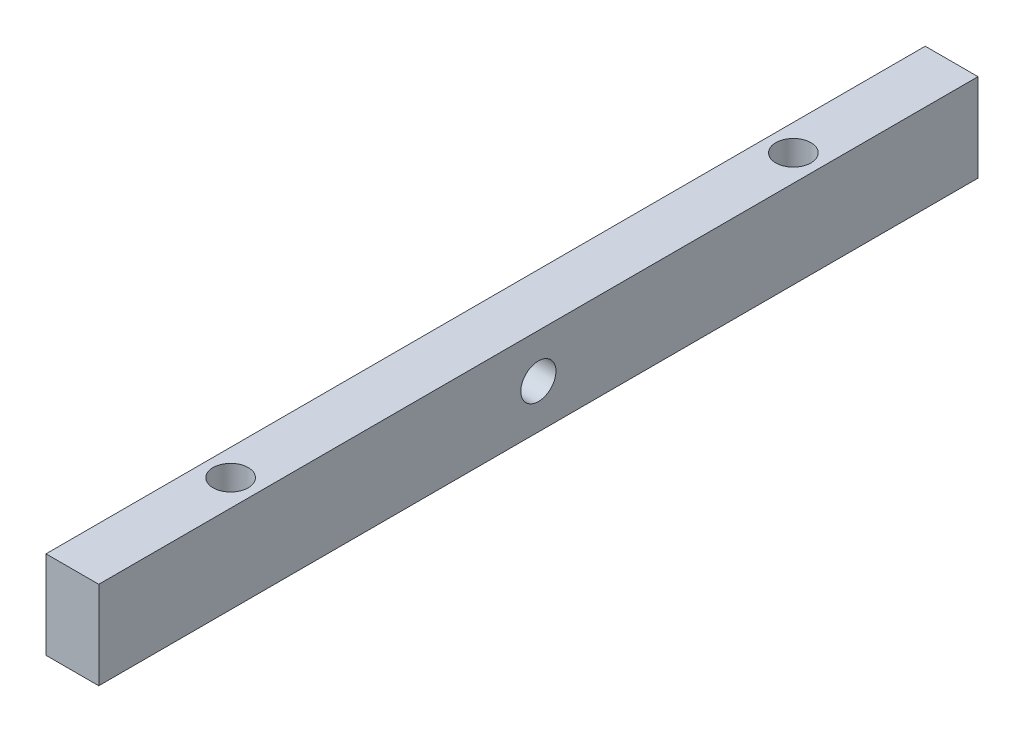
ISO-10303-21;
HEADER;
FILE_DESCRIPTION(('STEP AP214'),'2;1');
FILE_NAME('part.step','',(''),(''),'','','');
FILE_SCHEMA(('AUTOMOTIVE_DESIGN { 1 0 10303 214 1 1 1 1 }'));
ENDSEC;
DATA;
#1=APPLICATION_CONTEXT('core data for automotive mechanical design processes');
#2=APPLICATION_PROTOCOL_DEFINITION('international standard','automotive_design',2000,#1);
#3=PRODUCT_CONTEXT('',#1,'mechanical');
#4=PRODUCT('Part','Part','',(#3));
#5=PRODUCT_RELATED_PRODUCT_CATEGORY('part','',(#4));
#6=PRODUCT_DEFINITION_FORMATION('','',#4);
#7=PRODUCT_DEFINITION_CONTEXT('part definition',#1,'design');
#8=PRODUCT_DEFINITION('design','',#6,#7);
#9=PRODUCT_DEFINITION_SHAPE('','',#8);
#10=(LENGTH_UNIT() NAMED_UNIT(*) SI_UNIT(.MILLI.,.METRE.));
#11=(NAMED_UNIT(*) PLANE_ANGLE_UNIT() SI_UNIT($,.RADIAN.));
#12=(NAMED_UNIT(*) SI_UNIT($,.STERADIAN.) SOLID_ANGLE_UNIT());
#13=UNCERTAINTY_MEASURE_WITH_UNIT(LENGTH_MEASURE(1.E-05),#10,'distance_accuracy_value','');
#14=(GEOMETRIC_REPRESENTATION_CONTEXT(3) GLOBAL_UNCERTAINTY_ASSIGNED_CONTEXT((#13)) GLOBAL_UNIT_ASSIGNED_CONTEXT((#10,
#11,#12)) REPRESENTATION_CONTEXT('',''));
#15=CARTESIAN_POINT('',(0.,0.,0.));
#16=DIRECTION('',(0.,0.,1.));
#17=DIRECTION('',(1.,0.,0.));
#18=AXIS2_PLACEMENT_3D('',#15,#16,#17);
#19=CARTESIAN_POINT('',(15.,25.,500.));
#20=DIRECTION('',(-1.,0.,0.));
#21=DIRECTION('',(0.,-1.,0.));
#22=AXIS2_PLACEMENT_3D('',#19,#20,#21);
#23=PLANE('',#22);
#24=CARTESIAN_POINT('',(15.,0.,250.));
#25=DIRECTION('',(-1.,0.,0.));
#26=DIRECTION('',(0.,-1.,0.));
#27=AXIS2_PLACEMENT_3D('',#24,#25,#26);
#28=CIRCLE('',#27,9.99999999999998);
#29=CARTESIAN_POINT('',(15.,-9.99999999999997,250.));
#30=VERTEX_POINT('',#29);
#31=EDGE_CURVE('E117',#30,#30,#28,.T.);
#32=ORIENTED_EDGE('',*,*,#31,.T.);
#33=EDGE_LOOP('',(#32));
#34=FACE_BOUND('',#33,.T.);
#35=DIRECTION('',(0.,1.,0.));
#36=VECTOR('',#35,1.);
#37=CARTESIAN_POINT('',(15.,25.,0.));
#38=LINE('',#37,#36);
#39=CARTESIAN_POINT('',(15.,-25.,0.));
#40=VERTEX_POINT('',#39);
#41=CARTESIAN_POINT('',(15.,25.,0.));
#42=VERTEX_POINT('',#41);
#43=EDGE_CURVE('E99',#40,#42,#38,.T.);
#44=ORIENTED_EDGE('',*,*,#43,.T.);
#45=DIRECTION('',(0.,0.,-1.));
#46=VECTOR('',#45,1.);
#47=CARTESIAN_POINT('',(15.,25.,500.));
#48=LINE('',#47,#46);
#49=CARTESIAN_POINT('',(15.,25.,500.));
#50=VERTEX_POINT('',#49);
#51=EDGE_CURVE('E11',#50,#42,#48,.T.);
#52=ORIENTED_EDGE('',*,*,#51,.F.);
#53=DIRECTION('',(0.,1.,0.));
#54=VECTOR('',#53,1.);
#55=CARTESIAN_POINT('',(15.,25.,500.));
#56=LINE('',#55,#54);
#57=CARTESIAN_POINT('',(15.,-25.,500.));
#58=VERTEX_POINT('',#57);
#59=EDGE_CURVE('E87',#58,#50,#56,.T.);
#60=ORIENTED_EDGE('',*,*,#59,.F.);
#61=DIRECTION('',(0.,0.,-1.));
#62=VECTOR('',#61,1.);
#63=CARTESIAN_POINT('',(15.,-25.,500.));
#64=LINE('',#63,#62);
#65=EDGE_CURVE('E95',#58,#40,#64,.T.);
#66=ORIENTED_EDGE('',*,*,#65,.T.);
#67=EDGE_LOOP('',(#44,#52,#60,#66));
#68=FACE_BOUND('',#67,.T.);
#69=ADVANCED_FACE('F36',(#34,#68),#23,.F.);
#70=CARTESIAN_POINT('',(-15.,25.,500.));
#71=DIRECTION('',(0.,-1.,0.));
#72=DIRECTION('',(0.,0.,-1.));
#73=AXIS2_PLACEMENT_3D('',#70,#71,#72);
#74=PLANE('',#73);
#75=CARTESIAN_POINT('',(0.,25.,90.));
#76=DIRECTION('',(0.,1.,0.));
#77=DIRECTION('',(0.,0.,1.));
#78=AXIS2_PLACEMENT_3D('',#75,#76,#77);
#79=CIRCLE('',#78,10.);
#80=CARTESIAN_POINT('',(0.,25.,100.));
#81=VERTEX_POINT('',#80);
#82=EDGE_CURVE('E120',#81,#81,#79,.T.);
#83=ORIENTED_EDGE('',*,*,#82,.F.);
#84=EDGE_LOOP('',(#83));
#85=FACE_BOUND('',#84,.T.);
#86=CARTESIAN_POINT('',(0.,25.,410.));
#87=DIRECTION('',(0.,1.,0.));
#88=DIRECTION('',(0.,0.,-1.));
#89=AXIS2_PLACEMENT_3D('',#86,#87,#88);
#90=CIRCLE('',#89,10.);
#91=CARTESIAN_POINT('',(0.,25.,400.));
#92=VERTEX_POINT('',#91);
#93=EDGE_CURVE('E113',#92,#92,#90,.T.);
#94=ORIENTED_EDGE('',*,*,#93,.F.);
#95=EDGE_LOOP('',(#94));
#96=FACE_BOUND('',#95,.T.);
#97=DIRECTION('',(-1.,0.,0.));
#98=VECTOR('',#97,1.);
#99=CARTESIAN_POINT('',(-15.,25.,0.));
#100=LINE('',#99,#98);
#101=CARTESIAN_POINT('',(-15.,25.,0.));
#102=VERTEX_POINT('',#101);
#103=EDGE_CURVE('E91',#42,#102,#100,.T.);
#104=ORIENTED_EDGE('',*,*,#103,.T.);
#105=DIRECTION('',(0.,0.,-1.));
#106=VECTOR('',#105,1.);
#107=CARTESIAN_POINT('',(-15.,25.,500.));
#108=LINE('',#107,#106);
#109=CARTESIAN_POINT('',(-15.,25.,500.));
#110=VERTEX_POINT('',#109);
#111=EDGE_CURVE('E44',#110,#102,#108,.T.);
#112=ORIENTED_EDGE('',*,*,#111,.F.);
#113=DIRECTION('',(-1.,0.,0.));
#114=VECTOR('',#113,1.);
#115=CARTESIAN_POINT('',(-15.,25.,500.));
#116=LINE('',#115,#114);
#117=EDGE_CURVE('E82',#50,#110,#116,.T.);
#118=ORIENTED_EDGE('',*,*,#117,.F.);
#119=ORIENTED_EDGE('',*,*,#51,.T.);
#120=EDGE_LOOP('',(#104,#112,#118,#119));
#121=FACE_BOUND('',#120,.T.);
#122=ADVANCED_FACE('F90',(#85,#96,#121),#74,.F.);
#123=CARTESIAN_POINT('',(-15.,25.,500.));
#124=DIRECTION('',(1.,0.,0.));
#125=DIRECTION('',(0.,1.,0.));
#126=AXIS2_PLACEMENT_3D('',#123,#124,#125);
#127=PLANE('',#126);
#128=CARTESIAN_POINT('',(-15.,0.,250.));
#129=DIRECTION('',(-1.,0.,0.));
#130=DIRECTION('',(0.,-1.,0.));
#131=AXIS2_PLACEMENT_3D('',#128,#129,#130);
#132=CIRCLE('',#131,9.99999999999998);
#133=CARTESIAN_POINT('',(-15.,-9.99999999999998,250.));
#134=VERTEX_POINT('',#133);
#135=EDGE_CURVE('E125',#134,#134,#132,.T.);
#136=ORIENTED_EDGE('',*,*,#135,.F.);
#137=EDGE_LOOP('',(#136));
#138=FACE_BOUND('',#137,.T.);
#139=DIRECTION('',(0.,-1.,0.));
#140=VECTOR('',#139,1.);
#141=CARTESIAN_POINT('',(-15.,25.,0.));
#142=LINE('',#141,#140);
#143=CARTESIAN_POINT('',(-15.,-25.,0.));
#144=VERTEX_POINT('',#143);
#145=EDGE_CURVE('E69',#102,#144,#142,.T.);
#146=ORIENTED_EDGE('',*,*,#145,.T.);
#147=DIRECTION('',(0.,0.,-1.));
#148=VECTOR('',#147,1.);
#149=CARTESIAN_POINT('',(-15.,-25.,500.));
#150=LINE('',#149,#148);
#151=CARTESIAN_POINT('',(-15.,-25.,500.));
#152=VERTEX_POINT('',#151);
#153=EDGE_CURVE('E92',#152,#144,#150,.T.);
#154=ORIENTED_EDGE('',*,*,#153,.F.);
#155=DIRECTION('',(0.,-1.,0.));
#156=VECTOR('',#155,1.);
#157=CARTESIAN_POINT('',(-15.,25.,500.));
#158=LINE('',#157,#156);
#159=EDGE_CURVE('E85',#110,#152,#158,.T.);
#160=ORIENTED_EDGE('',*,*,#159,.F.);
#161=ORIENTED_EDGE('',*,*,#111,.T.);
#162=EDGE_LOOP('',(#146,#154,#160,#161));
#163=FACE_BOUND('',#162,.T.);
#164=ADVANCED_FACE('F93',(#138,#163),#127,.F.);
#165=CARTESIAN_POINT('',(-15.,-25.,500.));
#166=DIRECTION('',(0.,1.,0.));
#167=DIRECTION('',(0.,0.,1.));
#168=AXIS2_PLACEMENT_3D('',#165,#166,#167);
#169=PLANE('',#168);
#170=CARTESIAN_POINT('',(0.,-25.,90.));
#171=DIRECTION('',(0.,1.,0.));
#172=DIRECTION('',(0.,0.,1.));
#173=AXIS2_PLACEMENT_3D('',#170,#171,#172);
#174=CIRCLE('',#173,10.);
#175=CARTESIAN_POINT('',(0.,-25.,100.));
#176=VERTEX_POINT('',#175);
#177=EDGE_CURVE('E102',#176,#176,#174,.T.);
#178=ORIENTED_EDGE('',*,*,#177,.T.);
#179=EDGE_LOOP('',(#178));
#180=FACE_BOUND('',#179,.T.);
#181=CARTESIAN_POINT('',(0.,-25.,410.));
#182=DIRECTION('',(0.,1.,0.));
#183=DIRECTION('',(0.,0.,-1.));
#184=AXIS2_PLACEMENT_3D('',#181,#182,#183);
#185=CIRCLE('',#184,10.);
#186=CARTESIAN_POINT('',(0.,-25.,400.));
#187=VERTEX_POINT('',#186);
#188=EDGE_CURVE('E116',#187,#187,#185,.T.);
#189=ORIENTED_EDGE('',*,*,#188,.T.);
#190=EDGE_LOOP('',(#189));
#191=FACE_BOUND('',#190,.T.);
#192=DIRECTION('',(1.,0.,0.));
#193=VECTOR('',#192,1.);
#194=CARTESIAN_POINT('',(-15.,-25.,0.));
#195=LINE('',#194,#193);
#196=EDGE_CURVE('E75',#144,#40,#195,.T.);
#197=ORIENTED_EDGE('',*,*,#196,.T.);
#198=ORIENTED_EDGE('',*,*,#65,.F.);
#199=DIRECTION('',(1.,0.,0.));
#200=VECTOR('',#199,1.);
#201=CARTESIAN_POINT('',(-15.,-25.,500.));
#202=LINE('',#201,#200);
#203=EDGE_CURVE('E52',#152,#58,#202,.T.);
#204=ORIENTED_EDGE('',*,*,#203,.F.);
#205=ORIENTED_EDGE('',*,*,#153,.T.);
#206=EDGE_LOOP('',(#197,#198,#204,#205));
#207=FACE_BOUND('',#206,.T.);
#208=ADVANCED_FACE('F107',(#180,#191,#207),#169,.F.);
#209=CARTESIAN_POINT('',(0.,0.,500.));
#210=DIRECTION('',(0.,0.,1.));
#211=DIRECTION('',(1.,0.,0.));
#212=AXIS2_PLACEMENT_3D('',#209,#210,#211);
#213=PLANE('',#212);
#214=ORIENTED_EDGE('',*,*,#59,.T.);
#215=ORIENTED_EDGE('',*,*,#117,.T.);
#216=ORIENTED_EDGE('',*,*,#159,.T.);
#217=ORIENTED_EDGE('',*,*,#203,.T.);
#218=EDGE_LOOP('',(#214,#215,#216,#217));
#219=FACE_BOUND('',#218,.T.);
#220=ADVANCED_FACE('F83',(#219),#213,.T.);
#221=CARTESIAN_POINT('',(0.,0.,0.));
#222=DIRECTION('',(0.,0.,1.));
#223=DIRECTION('',(1.,0.,0.));
#224=AXIS2_PLACEMENT_3D('',#221,#222,#223);
#225=PLANE('',#224);
#226=ORIENTED_EDGE('',*,*,#43,.F.);
#227=ORIENTED_EDGE('',*,*,#196,.F.);
#228=ORIENTED_EDGE('',*,*,#145,.F.);
#229=ORIENTED_EDGE('',*,*,#103,.F.);
#230=EDGE_LOOP('',(#226,#227,#228,#229));
#231=FACE_BOUND('',#230,.T.);
#232=ADVANCED_FACE('F110',(#231),#225,.F.);
#233=CARTESIAN_POINT('',(0.,-25.,410.));
#234=DIRECTION('',(0.,1.,0.));
#235=DIRECTION('',(0.,0.,1.));
#236=AXIS2_PLACEMENT_3D('',#233,#234,#235);
#237=CYLINDRICAL_SURFACE('',#236,10.);
#238=ORIENTED_EDGE('',*,*,#188,.F.);
#239=EDGE_LOOP('',(#238));
#240=FACE_BOUND('',#239,.T.);
#241=ORIENTED_EDGE('',*,*,#93,.T.);
#242=EDGE_LOOP('',(#241));
#243=FACE_BOUND('',#242,.T.);
#244=ADVANCED_FACE('F160',(#240,#243),#237,.F.);
#245=CARTESIAN_POINT('',(0.,-25.,90.));
#246=DIRECTION('',(0.,1.,0.));
#247=DIRECTION('',(0.,0.,1.));
#248=AXIS2_PLACEMENT_3D('',#245,#246,#247);
#249=CYLINDRICAL_SURFACE('',#248,10.);
#250=ORIENTED_EDGE('',*,*,#177,.F.);
#251=EDGE_LOOP('',(#250));
#252=FACE_BOUND('',#251,.T.);
#253=ORIENTED_EDGE('',*,*,#82,.T.);
#254=EDGE_LOOP('',(#253));
#255=FACE_BOUND('',#254,.T.);
#256=ADVANCED_FACE('F135',(#252,#255),#249,.F.);
#257=CARTESIAN_POINT('',(15.,0.,250.));
#258=DIRECTION('',(-1.,0.,0.));
#259=DIRECTION('',(0.,-1.,0.));
#260=AXIS2_PLACEMENT_3D('',#257,#258,#259);
#261=CYLINDRICAL_SURFACE('',#260,9.99999999999998);
#262=CARTESIAN_POINT('',(15.,-9.99999999999997,250.));
#263=CARTESIAN_POINT('',(14.6875,-9.99999999999997,250.));
#264=CARTESIAN_POINT('',(14.375,-9.99999999999997,250.));
#265=CARTESIAN_POINT('',(13.75,-9.99999999999997,250.));
#266=CARTESIAN_POINT('',(13.4375,-9.99999999999997,250.));
#267=CARTESIAN_POINT('',(12.8125,-9.99999999999997,250.));
#268=CARTESIAN_POINT('',(12.5,-9.99999999999997,250.));
#269=CARTESIAN_POINT('',(11.875,-9.99999999999997,250.));
#270=CARTESIAN_POINT('',(11.5625,-9.99999999999997,250.));
#271=CARTESIAN_POINT('',(10.9375,-9.99999999999997,250.));
#272=CARTESIAN_POINT('',(10.625,-9.99999999999997,250.));
#273=CARTESIAN_POINT('',(10.,-9.99999999999997,250.));
#274=CARTESIAN_POINT('',(9.6875,-9.99999999999997,250.));
#275=CARTESIAN_POINT('',(9.0625,-9.99999999999997,250.));
#276=CARTESIAN_POINT('',(8.75,-9.99999999999997,250.));
#277=CARTESIAN_POINT('',(8.125,-9.99999999999997,250.));
#278=CARTESIAN_POINT('',(7.8125,-9.99999999999997,250.));
#279=CARTESIAN_POINT('',(7.1875,-9.99999999999997,250.));
#280=CARTESIAN_POINT('',(6.875,-9.99999999999997,250.));
#281=CARTESIAN_POINT('',(6.25,-9.99999999999997,250.));
#282=CARTESIAN_POINT('',(5.9375,-9.99999999999997,250.));
#283=CARTESIAN_POINT('',(5.3125,-9.99999999999997,250.));
#284=CARTESIAN_POINT('',(5.,-9.99999999999997,250.));
#285=CARTESIAN_POINT('',(4.375,-9.99999999999997,250.));
#286=CARTESIAN_POINT('',(4.0625,-9.99999999999997,250.));
#287=CARTESIAN_POINT('',(3.4375,-9.99999999999997,250.));
#288=CARTESIAN_POINT('',(3.125,-9.99999999999997,250.));
#289=CARTESIAN_POINT('',(2.5,-9.99999999999997,250.));
#290=CARTESIAN_POINT('',(2.1875,-9.99999999999997,250.));
#291=CARTESIAN_POINT('',(1.5625,-9.99999999999997,250.));
#292=CARTESIAN_POINT('',(1.25,-9.99999999999997,250.));
#293=CARTESIAN_POINT('',(0.625000000000002,-9.99999999999997,250.));
#294=CARTESIAN_POINT('',(0.312500000000002,-9.99999999999997,250.));
#295=CARTESIAN_POINT('',(-0.312499999999997,-9.99999999999997,250.));
#296=CARTESIAN_POINT('',(-0.624999999999996,-9.99999999999997,250.));
#297=CARTESIAN_POINT('',(-1.25,-9.99999999999997,250.));
#298=CARTESIAN_POINT('',(-1.5625,-9.99999999999997,250.));
#299=CARTESIAN_POINT('',(-2.1875,-9.99999999999997,250.));
#300=CARTESIAN_POINT('',(-2.49999999999999,-9.99999999999997,250.));
#301=CARTESIAN_POINT('',(-3.12499999999999,-9.99999999999997,250.));
#302=CARTESIAN_POINT('',(-3.43749999999999,-9.99999999999998,250.));
#303=CARTESIAN_POINT('',(-4.06249999999999,-9.99999999999998,250.));
#304=CARTESIAN_POINT('',(-4.375,-9.99999999999998,250.));
#305=CARTESIAN_POINT('',(-5.,-9.99999999999998,250.));
#306=CARTESIAN_POINT('',(-5.3125,-9.99999999999998,250.));
#307=CARTESIAN_POINT('',(-5.9375,-9.99999999999998,250.));
#308=CARTESIAN_POINT('',(-6.25,-9.99999999999998,250.));
#309=CARTESIAN_POINT('',(-6.875,-9.99999999999998,250.));
#310=CARTESIAN_POINT('',(-7.1875,-9.99999999999998,250.));
#311=CARTESIAN_POINT('',(-7.8125,-9.99999999999998,250.));
#312=CARTESIAN_POINT('',(-8.125,-9.99999999999998,250.));
#313=CARTESIAN_POINT('',(-8.75,-9.99999999999998,250.));
#314=CARTESIAN_POINT('',(-9.0625,-9.99999999999998,250.));
#315=CARTESIAN_POINT('',(-9.6875,-9.99999999999998,250.));
#316=CARTESIAN_POINT('',(-10.,-9.99999999999998,250.));
#317=CARTESIAN_POINT('',(-10.625,-9.99999999999998,250.));
#318=CARTESIAN_POINT('',(-10.9375,-9.99999999999998,250.));
#319=CARTESIAN_POINT('',(-11.5625,-9.99999999999998,250.));
#320=CARTESIAN_POINT('',(-11.875,-9.99999999999998,250.));
#321=CARTESIAN_POINT('',(-12.5,-9.99999999999998,250.));
#322=CARTESIAN_POINT('',(-12.8125,-9.99999999999998,250.));
#323=CARTESIAN_POINT('',(-13.4375,-9.99999999999998,250.));
#324=CARTESIAN_POINT('',(-13.75,-9.99999999999998,250.));
#325=CARTESIAN_POINT('',(-14.375,-9.99999999999998,250.));
#326=CARTESIAN_POINT('',(-14.6875,-9.99999999999998,250.));
#327=CARTESIAN_POINT('',(-15.,-9.99999999999998,250.));
#328=B_SPLINE_CURVE_WITH_KNOTS('',3,(#262,#263,#264,#265,#266,#267,#268,#269,#270,#271,#272,
#273,#274,#275,#276,#277,#278,#279,#280,#281,#282,#283,#284,#285,#286,#287,#288,#289,#290,#291,
#292,#293,#294,#295,#296,#297,#298,#299,#300,#301,#302,#303,#304,#305,#306,#307,#308,#309,#310,
#311,#312,#313,#314,#315,#316,#317,#318,#319,#320,#321,#322,#323,#324,#325,#326,#327),
.UNSPECIFIED.,.F.,.F.,(4,2,2,2,2,2,2,2,2,2,2,2,2,2,2,2,2,2,2,2,2,2,2,2,2,2,2,2,2,2,2,2,4),(0.,
0.937499999999999,1.875,2.8125,3.75,4.6875,5.625,6.5625,7.5,8.4375,9.375,10.3125,11.25,12.1875,
13.125,14.0625,15.,15.9375,16.875,17.8125,18.75,19.6875,20.625,21.5625,22.5,23.4375,24.375,
25.3125,26.25,27.1875,28.125,29.0625,30.),.UNSPECIFIED.);
#329=EDGE_CURVE('BSEAM132',#30,#134,#328,.T.);
#330=ORIENTED_EDGE('',*,*,#31,.F.);
#331=ORIENTED_EDGE('',*,*,#135,.T.);
#332=ORIENTED_EDGE('',*,*,#329,.T.);
#333=ORIENTED_EDGE('',*,*,#329,.F.);
#334=EDGE_LOOP('',(#330,#332,#331,#333));
#335=FACE_BOUND('',#334,.T.);
#336=ADVANCED_FACE('F132',(#335),#261,.F.);
#337=CLOSED_SHELL('',(#69,#122,#164,#208,#220,#232,#244,#256,#336));
#338=MANIFOLD_SOLID_BREP('B2',#337);
#339=ADVANCED_BREP_SHAPE_REPRESENTATION('',(#18,#338),#14);
#340=SHAPE_DEFINITION_REPRESENTATION(#9,#339);
ENDSEC;
END-ISO-10303-21;
